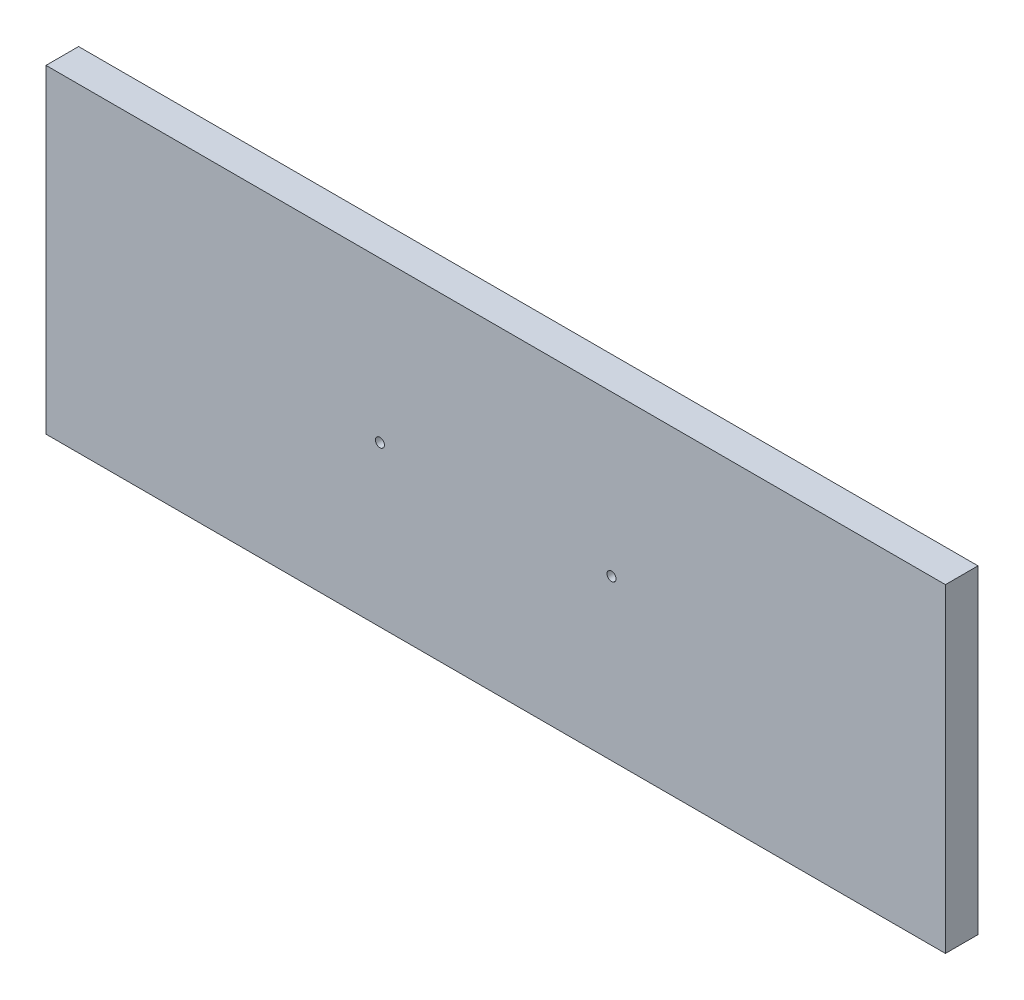
ISO-10303-21;
HEADER;
FILE_DESCRIPTION(('STEP AP214'),'2;1');
FILE_NAME('part.step','',(''),(''),'','','');
FILE_SCHEMA(('AUTOMOTIVE_DESIGN { 1 0 10303 214 1 1 1 1 }'));
ENDSEC;
DATA;
#1=APPLICATION_CONTEXT('core data for automotive mechanical design processes');
#2=APPLICATION_PROTOCOL_DEFINITION('international standard','automotive_design',2000,#1);
#3=PRODUCT_CONTEXT('',#1,'mechanical');
#4=PRODUCT('Part','Part','',(#3));
#5=PRODUCT_RELATED_PRODUCT_CATEGORY('part','',(#4));
#6=PRODUCT_DEFINITION_FORMATION('','',#4);
#7=PRODUCT_DEFINITION_CONTEXT('part definition',#1,'design');
#8=PRODUCT_DEFINITION('design','',#6,#7);
#9=PRODUCT_DEFINITION_SHAPE('','',#8);
#10=(LENGTH_UNIT() NAMED_UNIT(*) SI_UNIT(.MILLI.,.METRE.));
#11=(NAMED_UNIT(*) PLANE_ANGLE_UNIT() SI_UNIT($,.RADIAN.));
#12=(NAMED_UNIT(*) SI_UNIT($,.STERADIAN.) SOLID_ANGLE_UNIT());
#13=UNCERTAINTY_MEASURE_WITH_UNIT(LENGTH_MEASURE(1.E-05),#10,'distance_accuracy_value','');
#14=(GEOMETRIC_REPRESENTATION_CONTEXT(3) GLOBAL_UNCERTAINTY_ASSIGNED_CONTEXT((#13)) GLOBAL_UNIT_ASSIGNED_CONTEXT((#10,
#11,#12)) REPRESENTATION_CONTEXT('',''));
#15=CARTESIAN_POINT('',(0.,0.,0.));
#16=DIRECTION('',(0.,0.,1.));
#17=DIRECTION('',(1.,0.,0.));
#18=AXIS2_PLACEMENT_3D('',#15,#16,#17);
#19=CARTESIAN_POINT('',(248.5,-391.,18.));
#20=DIRECTION('',(-1.,0.,0.));
#21=DIRECTION('',(0.,0.,1.));
#22=AXIS2_PLACEMENT_3D('',#19,#20,#21);
#23=PLANE('',#22);
#24=DIRECTION('',(0.,1.,0.));
#25=VECTOR('',#24,1.);
#26=CARTESIAN_POINT('',(248.5,-391.,0.));
#27=LINE('',#26,#25);
#28=CARTESIAN_POINT('',(248.5,-391.,0.));
#29=VERTEX_POINT('',#28);
#30=CARTESIAN_POINT('',(248.5,-214.5,0.));
#31=VERTEX_POINT('',#30);
#32=EDGE_CURVE('E96',#29,#31,#27,.T.);
#33=ORIENTED_EDGE('',*,*,#32,.T.);
#34=DIRECTION('',(0.,0.,-1.));
#35=VECTOR('',#34,1.);
#36=CARTESIAN_POINT('',(248.5,-214.5,18.));
#37=LINE('',#36,#35);
#38=CARTESIAN_POINT('',(248.5,-214.5,18.));
#39=VERTEX_POINT('',#38);
#40=EDGE_CURVE('E11',#39,#31,#37,.T.);
#41=ORIENTED_EDGE('',*,*,#40,.F.);
#42=DIRECTION('',(0.,1.,0.));
#43=VECTOR('',#42,1.);
#44=CARTESIAN_POINT('',(248.5,-391.,18.));
#45=LINE('',#44,#43);
#46=CARTESIAN_POINT('',(248.5,-391.,18.));
#47=VERTEX_POINT('',#46);
#48=EDGE_CURVE('E84',#47,#39,#45,.T.);
#49=ORIENTED_EDGE('',*,*,#48,.F.);
#50=DIRECTION('',(0.,0.,-1.));
#51=VECTOR('',#50,1.);
#52=CARTESIAN_POINT('',(248.5,-391.,18.));
#53=LINE('',#52,#51);
#54=EDGE_CURVE('E92',#47,#29,#53,.T.);
#55=ORIENTED_EDGE('',*,*,#54,.T.);
#56=EDGE_LOOP('',(#33,#41,#49,#55));
#57=FACE_BOUND('',#56,.T.);
#58=ADVANCED_FACE('F33',(#57),#23,.F.);
#59=CARTESIAN_POINT('',(248.5,-214.5,18.));
#60=DIRECTION('',(0.,-1.,0.));
#61=DIRECTION('',(1.,0.,0.));
#62=AXIS2_PLACEMENT_3D('',#59,#60,#61);
#63=PLANE('',#62);
#64=DIRECTION('',(-1.,0.,0.));
#65=VECTOR('',#64,1.);
#66=CARTESIAN_POINT('',(248.5,-214.5,0.));
#67=LINE('',#66,#65);
#68=CARTESIAN_POINT('',(-248.5,-214.5,0.));
#69=VERTEX_POINT('',#68);
#70=EDGE_CURVE('E88',#31,#69,#67,.T.);
#71=ORIENTED_EDGE('',*,*,#70,.T.);
#72=DIRECTION('',(0.,0.,-1.));
#73=VECTOR('',#72,1.);
#74=CARTESIAN_POINT('',(-248.5,-214.5,18.));
#75=LINE('',#74,#73);
#76=CARTESIAN_POINT('',(-248.5,-214.5,18.));
#77=VERTEX_POINT('',#76);
#78=EDGE_CURVE('E41',#77,#69,#75,.T.);
#79=ORIENTED_EDGE('',*,*,#78,.F.);
#80=DIRECTION('',(-1.,0.,0.));
#81=VECTOR('',#80,1.);
#82=CARTESIAN_POINT('',(248.5,-214.5,18.));
#83=LINE('',#82,#81);
#84=EDGE_CURVE('E79',#39,#77,#83,.T.);
#85=ORIENTED_EDGE('',*,*,#84,.F.);
#86=ORIENTED_EDGE('',*,*,#40,.T.);
#87=EDGE_LOOP('',(#71,#79,#85,#86));
#88=FACE_BOUND('',#87,.T.);
#89=ADVANCED_FACE('F87',(#88),#63,.F.);
#90=CARTESIAN_POINT('',(-248.5,-391.,18.));
#91=DIRECTION('',(1.,0.,0.));
#92=DIRECTION('',(0.,0.,-1.));
#93=AXIS2_PLACEMENT_3D('',#90,#91,#92);
#94=PLANE('',#93);
#95=DIRECTION('',(0.,-1.,0.));
#96=VECTOR('',#95,1.);
#97=CARTESIAN_POINT('',(-248.5,-391.,0.));
#98=LINE('',#97,#96);
#99=CARTESIAN_POINT('',(-248.5,-391.,0.));
#100=VERTEX_POINT('',#99);
#101=EDGE_CURVE('E66',#69,#100,#98,.T.);
#102=ORIENTED_EDGE('',*,*,#101,.T.);
#103=DIRECTION('',(0.,0.,-1.));
#104=VECTOR('',#103,1.);
#105=CARTESIAN_POINT('',(-248.5,-391.,18.));
#106=LINE('',#105,#104);
#107=CARTESIAN_POINT('',(-248.5,-391.,18.));
#108=VERTEX_POINT('',#107);
#109=EDGE_CURVE('E89',#108,#100,#106,.T.);
#110=ORIENTED_EDGE('',*,*,#109,.F.);
#111=DIRECTION('',(0.,-1.,0.));
#112=VECTOR('',#111,1.);
#113=CARTESIAN_POINT('',(-248.5,-391.,18.));
#114=LINE('',#113,#112);
#115=EDGE_CURVE('E82',#77,#108,#114,.T.);
#116=ORIENTED_EDGE('',*,*,#115,.F.);
#117=ORIENTED_EDGE('',*,*,#78,.T.);
#118=EDGE_LOOP('',(#102,#110,#116,#117));
#119=FACE_BOUND('',#118,.T.);
#120=ADVANCED_FACE('F90',(#119),#94,.F.);
#121=CARTESIAN_POINT('',(248.5,-391.,18.));
#122=DIRECTION('',(0.,1.,0.));
#123=DIRECTION('',(-1.,0.,0.));
#124=AXIS2_PLACEMENT_3D('',#121,#122,#123);
#125=PLANE('',#124);
#126=DIRECTION('',(1.,0.,0.));
#127=VECTOR('',#126,1.);
#128=CARTESIAN_POINT('',(248.5,-391.,0.));
#129=LINE('',#128,#127);
#130=EDGE_CURVE('E72',#100,#29,#129,.T.);
#131=ORIENTED_EDGE('',*,*,#130,.T.);
#132=ORIENTED_EDGE('',*,*,#54,.F.);
#133=DIRECTION('',(1.,0.,0.));
#134=VECTOR('',#133,1.);
#135=CARTESIAN_POINT('',(248.5,-391.,18.));
#136=LINE('',#135,#134);
#137=EDGE_CURVE('E49',#108,#47,#136,.T.);
#138=ORIENTED_EDGE('',*,*,#137,.F.);
#139=ORIENTED_EDGE('',*,*,#109,.T.);
#140=EDGE_LOOP('',(#131,#132,#138,#139));
#141=FACE_BOUND('',#140,.T.);
#142=ADVANCED_FACE('F104',(#141),#125,.F.);
#143=CARTESIAN_POINT('',(0.,0.,18.));
#144=DIRECTION('',(0.,0.,1.));
#145=DIRECTION('',(1.,0.,0.));
#146=AXIS2_PLACEMENT_3D('',#143,#144,#145);
#147=PLANE('',#146);
#148=CARTESIAN_POINT('',(-64.,-302.75,18.));
#149=DIRECTION('',(0.,0.,1.));
#150=DIRECTION('',(-1.,0.,0.));
#151=AXIS2_PLACEMENT_3D('',#148,#149,#150);
#152=CIRCLE('',#151,2.50000000000018);
#153=CARTESIAN_POINT('',(-66.5000000000002,-302.75,18.));
#154=VERTEX_POINT('',#153);
#155=EDGE_CURVE('E116',#154,#154,#152,.T.);
#156=ORIENTED_EDGE('',*,*,#155,.F.);
#157=EDGE_LOOP('',(#156));
#158=FACE_BOUND('',#157,.T.);
#159=CARTESIAN_POINT('',(64.,-302.75,18.));
#160=DIRECTION('',(0.,0.,1.));
#161=DIRECTION('',(1.,0.,0.));
#162=AXIS2_PLACEMENT_3D('',#159,#160,#161);
#163=CIRCLE('',#162,2.49999999999983);
#164=CARTESIAN_POINT('',(66.4999999999999,-302.75,18.));
#165=VERTEX_POINT('',#164);
#166=EDGE_CURVE('E110',#165,#165,#163,.T.);
#167=ORIENTED_EDGE('',*,*,#166,.F.);
#168=EDGE_LOOP('',(#167));
#169=FACE_BOUND('',#168,.T.);
#170=ORIENTED_EDGE('',*,*,#48,.T.);
#171=ORIENTED_EDGE('',*,*,#84,.T.);
#172=ORIENTED_EDGE('',*,*,#115,.T.);
#173=ORIENTED_EDGE('',*,*,#137,.T.);
#174=EDGE_LOOP('',(#170,#171,#172,#173));
#175=FACE_BOUND('',#174,.T.);
#176=ADVANCED_FACE('F80',(#158,#169,#175),#147,.T.);
#177=CARTESIAN_POINT('',(0.,0.,0.));
#178=DIRECTION('',(0.,0.,1.));
#179=DIRECTION('',(1.,0.,0.));
#180=AXIS2_PLACEMENT_3D('',#177,#178,#179);
#181=PLANE('',#180);
#182=CARTESIAN_POINT('',(224.,-334.5,0.));
#183=DIRECTION('',(0.,0.,-1.));
#184=DIRECTION('',(1.,0.,0.));
#185=AXIS2_PLACEMENT_3D('',#182,#183,#184);
#186=CIRCLE('',#185,5.00000000000002);
#187=CARTESIAN_POINT('',(229.,-334.5,0.));
#188=VERTEX_POINT('',#187);
#189=EDGE_CURVE('E140',#188,#188,#186,.T.);
#190=ORIENTED_EDGE('',*,*,#189,.F.);
#191=EDGE_LOOP('',(#190));
#192=FACE_BOUND('',#191,.T.);
#193=CARTESIAN_POINT('',(-224.,-334.5,0.));
#194=DIRECTION('',(0.,0.,-1.));
#195=DIRECTION('',(-1.,0.,0.));
#196=AXIS2_PLACEMENT_3D('',#193,#194,#195);
#197=CIRCLE('',#196,5.00000000000002);
#198=CARTESIAN_POINT('',(-229.,-334.5,0.));
#199=VERTEX_POINT('',#198);
#200=EDGE_CURVE('E134',#199,#199,#197,.T.);
#201=ORIENTED_EDGE('',*,*,#200,.F.);
#202=EDGE_LOOP('',(#201));
#203=FACE_BOUND('',#202,.T.);
#204=CARTESIAN_POINT('',(224.,-270.5,0.));
#205=DIRECTION('',(0.,0.,-1.));
#206=DIRECTION('',(1.,0.,0.));
#207=AXIS2_PLACEMENT_3D('',#204,#205,#206);
#208=CIRCLE('',#207,5.00000000000002);
#209=CARTESIAN_POINT('',(229.,-270.5,0.));
#210=VERTEX_POINT('',#209);
#211=EDGE_CURVE('E128',#210,#210,#208,.T.);
#212=ORIENTED_EDGE('',*,*,#211,.F.);
#213=EDGE_LOOP('',(#212));
#214=FACE_BOUND('',#213,.T.);
#215=CARTESIAN_POINT('',(-224.,-270.5,0.));
#216=DIRECTION('',(0.,0.,-1.));
#217=DIRECTION('',(-1.,0.,0.));
#218=AXIS2_PLACEMENT_3D('',#215,#216,#217);
#219=CIRCLE('',#218,5.00000000000002);
#220=CARTESIAN_POINT('',(-229.,-270.5,0.));
#221=VERTEX_POINT('',#220);
#222=EDGE_CURVE('E122',#221,#221,#219,.T.);
#223=ORIENTED_EDGE('',*,*,#222,.F.);
#224=EDGE_LOOP('',(#223));
#225=FACE_BOUND('',#224,.T.);
#226=CARTESIAN_POINT('',(-64.,-302.75,0.));
#227=DIRECTION('',(0.,0.,1.));
#228=DIRECTION('',(-1.,0.,0.));
#229=AXIS2_PLACEMENT_3D('',#226,#227,#228);
#230=CIRCLE('',#229,2.50000000000018);
#231=CARTESIAN_POINT('',(-66.5000000000002,-302.75,0.));
#232=VERTEX_POINT('',#231);
#233=EDGE_CURVE('E113',#232,#232,#230,.T.);
#234=ORIENTED_EDGE('',*,*,#233,.T.);
#235=EDGE_LOOP('',(#234));
#236=FACE_BOUND('',#235,.T.);
#237=CARTESIAN_POINT('',(64.,-302.75,0.));
#238=DIRECTION('',(0.,0.,1.));
#239=DIRECTION('',(1.,0.,0.));
#240=AXIS2_PLACEMENT_3D('',#237,#238,#239);
#241=CIRCLE('',#240,2.49999999999983);
#242=CARTESIAN_POINT('',(66.4999999999999,-302.75,0.));
#243=VERTEX_POINT('',#242);
#244=EDGE_CURVE('E99',#243,#243,#241,.T.);
#245=ORIENTED_EDGE('',*,*,#244,.T.);
#246=EDGE_LOOP('',(#245));
#247=FACE_BOUND('',#246,.T.);
#248=ORIENTED_EDGE('',*,*,#32,.F.);
#249=ORIENTED_EDGE('',*,*,#130,.F.);
#250=ORIENTED_EDGE('',*,*,#101,.F.);
#251=ORIENTED_EDGE('',*,*,#70,.F.);
#252=EDGE_LOOP('',(#248,#249,#250,#251));
#253=FACE_BOUND('',#252,.T.);
#254=ADVANCED_FACE('F107',(#192,#203,#214,#225,#236,#247,#253),#181,.F.);
#255=CARTESIAN_POINT('',(64.,-302.75,0.));
#256=DIRECTION('',(0.,0.,1.));
#257=DIRECTION('',(1.,0.,0.));
#258=AXIS2_PLACEMENT_3D('',#255,#256,#257);
#259=CYLINDRICAL_SURFACE('',#258,2.49999999999983);
#260=ORIENTED_EDGE('',*,*,#244,.F.);
#261=EDGE_LOOP('',(#260));
#262=FACE_BOUND('',#261,.T.);
#263=ORIENTED_EDGE('',*,*,#166,.T.);
#264=EDGE_LOOP('',(#263));
#265=FACE_BOUND('',#264,.T.);
#266=ADVANCED_FACE('F157',(#262,#265),#259,.F.);
#267=CARTESIAN_POINT('',(-64.,-302.75,0.));
#268=DIRECTION('',(0.,0.,1.));
#269=DIRECTION('',(1.,0.,0.));
#270=AXIS2_PLACEMENT_3D('',#267,#268,#269);
#271=CYLINDRICAL_SURFACE('',#270,2.50000000000018);
#272=ORIENTED_EDGE('',*,*,#233,.F.);
#273=EDGE_LOOP('',(#272));
#274=FACE_BOUND('',#273,.T.);
#275=ORIENTED_EDGE('',*,*,#155,.T.);
#276=EDGE_LOOP('',(#275));
#277=FACE_BOUND('',#276,.T.);
#278=ADVANCED_FACE('F171',(#274,#277),#271,.F.);
#279=CARTESIAN_POINT('',(-224.,-270.5,12.));
#280=DIRECTION('',(0.,0.,-1.));
#281=DIRECTION('',(-1.,0.,0.));
#282=AXIS2_PLACEMENT_3D('',#279,#280,#281);
#283=CYLINDRICAL_SURFACE('',#282,5.00000000000002);
#284=CARTESIAN_POINT('',(-224.,-270.5,12.));
#285=DIRECTION('',(0.,0.,-1.));
#286=DIRECTION('',(-1.,0.,0.));
#287=AXIS2_PLACEMENT_3D('',#284,#285,#286);
#288=CIRCLE('',#287,5.00000000000002);
#289=CARTESIAN_POINT('',(-229.,-270.5,12.));
#290=VERTEX_POINT('',#289);
#291=EDGE_CURVE('E119',#290,#290,#288,.T.);
#292=ORIENTED_EDGE('',*,*,#291,.F.);
#293=EDGE_LOOP('',(#292));
#294=FACE_BOUND('',#293,.T.);
#295=ORIENTED_EDGE('',*,*,#222,.T.);
#296=EDGE_LOOP('',(#295));
#297=FACE_BOUND('',#296,.T.);
#298=ADVANCED_FACE('F217',(#294,#297),#283,.F.);
#299=CARTESIAN_POINT('',(-224.,-270.5,12.));
#300=DIRECTION('',(0.,0.,-1.));
#301=DIRECTION('',(-1.,0.,0.));
#302=AXIS2_PLACEMENT_3D('',#299,#300,#301);
#303=PLANE('',#302);
#304=ORIENTED_EDGE('',*,*,#291,.T.);
#305=EDGE_LOOP('',(#304));
#306=FACE_BOUND('',#305,.T.);
#307=ADVANCED_FACE('F232',(#306),#303,.T.);
#308=CARTESIAN_POINT('',(224.,-270.5,12.));
#309=DIRECTION('',(0.,0.,-1.));
#310=DIRECTION('',(-1.,0.,0.));
#311=AXIS2_PLACEMENT_3D('',#308,#309,#310);
#312=CYLINDRICAL_SURFACE('',#311,5.00000000000002);
#313=CARTESIAN_POINT('',(224.,-270.5,12.));
#314=DIRECTION('',(0.,0.,-1.));
#315=DIRECTION('',(1.,0.,0.));
#316=AXIS2_PLACEMENT_3D('',#313,#314,#315);
#317=CIRCLE('',#316,5.00000000000002);
#318=CARTESIAN_POINT('',(229.,-270.5,12.));
#319=VERTEX_POINT('',#318);
#320=EDGE_CURVE('E125',#319,#319,#317,.T.);
#321=ORIENTED_EDGE('',*,*,#320,.F.);
#322=EDGE_LOOP('',(#321));
#323=FACE_BOUND('',#322,.T.);
#324=ORIENTED_EDGE('',*,*,#211,.T.);
#325=EDGE_LOOP('',(#324));
#326=FACE_BOUND('',#325,.T.);
#327=ADVANCED_FACE('F242',(#323,#326),#312,.F.);
#328=CARTESIAN_POINT('',(224.,-270.5,12.));
#329=DIRECTION('',(0.,0.,1.));
#330=DIRECTION('',(1.,0.,0.));
#331=AXIS2_PLACEMENT_3D('',#328,#329,#330);
#332=PLANE('',#331);
#333=ORIENTED_EDGE('',*,*,#320,.T.);
#334=EDGE_LOOP('',(#333));
#335=FACE_BOUND('',#334,.T.);
#336=ADVANCED_FACE('F252',(#335),#332,.F.);
#337=CARTESIAN_POINT('',(-224.,-334.5,12.));
#338=DIRECTION('',(0.,0.,-1.));
#339=DIRECTION('',(-1.,0.,0.));
#340=AXIS2_PLACEMENT_3D('',#337,#338,#339);
#341=CYLINDRICAL_SURFACE('',#340,5.00000000000002);
#342=CARTESIAN_POINT('',(-224.,-334.5,12.));
#343=DIRECTION('',(0.,0.,-1.));
#344=DIRECTION('',(-1.,0.,0.));
#345=AXIS2_PLACEMENT_3D('',#342,#343,#344);
#346=CIRCLE('',#345,5.00000000000002);
#347=CARTESIAN_POINT('',(-229.,-334.5,12.));
#348=VERTEX_POINT('',#347);
#349=EDGE_CURVE('E131',#348,#348,#346,.T.);
#350=ORIENTED_EDGE('',*,*,#349,.F.);
#351=EDGE_LOOP('',(#350));
#352=FACE_BOUND('',#351,.T.);
#353=ORIENTED_EDGE('',*,*,#200,.T.);
#354=EDGE_LOOP('',(#353));
#355=FACE_BOUND('',#354,.T.);
#356=ADVANCED_FACE('F262',(#352,#355),#341,.F.);
#357=CARTESIAN_POINT('',(-224.,-334.5,12.));
#358=DIRECTION('',(0.,0.,-1.));
#359=DIRECTION('',(-1.,0.,0.));
#360=AXIS2_PLACEMENT_3D('',#357,#358,#359);
#361=PLANE('',#360);
#362=ORIENTED_EDGE('',*,*,#349,.T.);
#363=EDGE_LOOP('',(#362));
#364=FACE_BOUND('',#363,.T.);
#365=ADVANCED_FACE('F151',(#364),#361,.T.);
#366=CARTESIAN_POINT('',(224.,-334.5,12.));
#367=DIRECTION('',(0.,0.,-1.));
#368=DIRECTION('',(-1.,0.,0.));
#369=AXIS2_PLACEMENT_3D('',#366,#367,#368);
#370=CYLINDRICAL_SURFACE('',#369,5.00000000000002);
#371=CARTESIAN_POINT('',(224.,-334.5,12.));
#372=DIRECTION('',(0.,0.,-1.));
#373=DIRECTION('',(1.,0.,0.));
#374=AXIS2_PLACEMENT_3D('',#371,#372,#373);
#375=CIRCLE('',#374,5.00000000000002);
#376=CARTESIAN_POINT('',(229.,-334.5,12.));
#377=VERTEX_POINT('',#376);
#378=EDGE_CURVE('E137',#377,#377,#375,.T.);
#379=ORIENTED_EDGE('',*,*,#378,.F.);
#380=EDGE_LOOP('',(#379));
#381=FACE_BOUND('',#380,.T.);
#382=ORIENTED_EDGE('',*,*,#189,.T.);
#383=EDGE_LOOP('',(#382));
#384=FACE_BOUND('',#383,.T.);
#385=ADVANCED_FACE('F148',(#381,#384),#370,.F.);
#386=CARTESIAN_POINT('',(224.,-334.5,12.));
#387=DIRECTION('',(0.,0.,1.));
#388=DIRECTION('',(1.,0.,0.));
#389=AXIS2_PLACEMENT_3D('',#386,#387,#388);
#390=PLANE('',#389);
#391=ORIENTED_EDGE('',*,*,#378,.T.);
#392=EDGE_LOOP('',(#391));
#393=FACE_BOUND('',#392,.T.);
#394=ADVANCED_FACE('F146',(#393),#390,.F.);
#395=CLOSED_SHELL('',(#58,#89,#120,#142,#176,#254,#266,#278,#298,#307,#327,#336,#356,#365,#385,#394));
#396=MANIFOLD_SOLID_BREP('B2',#395);
#397=ADVANCED_BREP_SHAPE_REPRESENTATION('',(#18,#396),#14);
#398=SHAPE_DEFINITION_REPRESENTATION(#9,#397);
ENDSEC;
END-ISO-10303-21;
